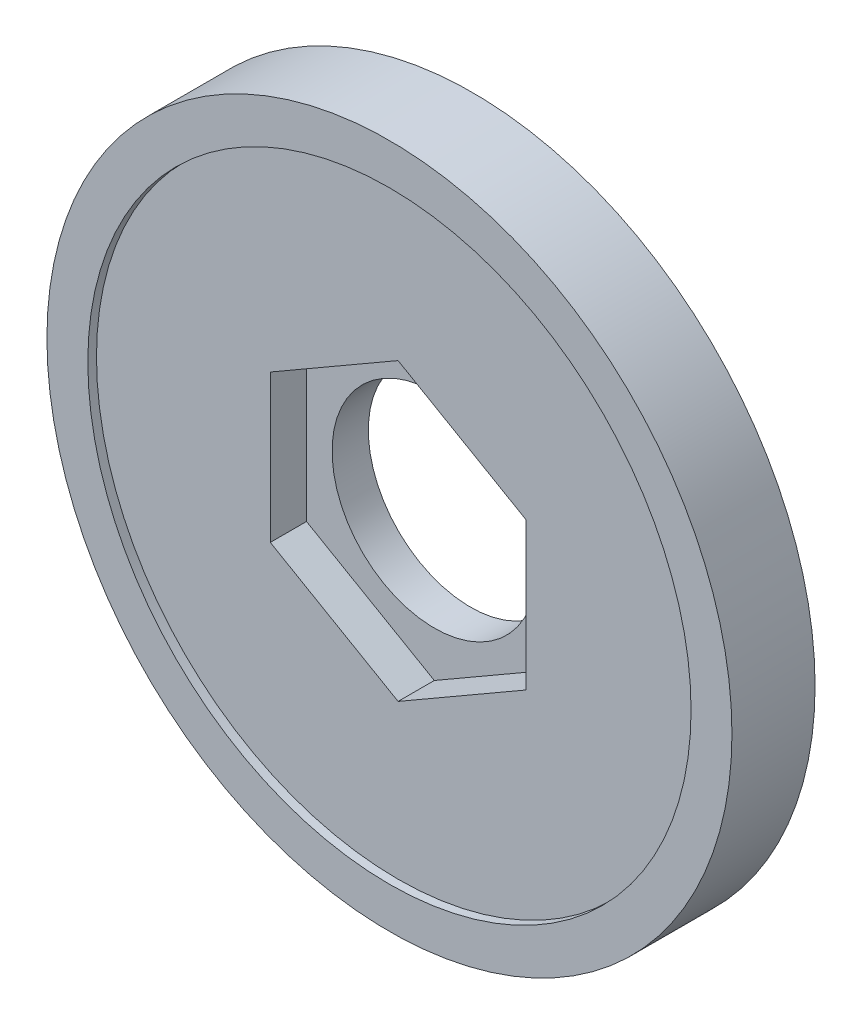
ISO-10303-21;
HEADER;
FILE_DESCRIPTION(('STEP AP214'),'2;1');
FILE_NAME('part.step','',(''),(''),'','','');
FILE_SCHEMA(('AUTOMOTIVE_DESIGN { 1 0 10303 214 1 1 1 1 }'));
ENDSEC;
DATA;
#1=APPLICATION_CONTEXT('core data for automotive mechanical design processes');
#2=APPLICATION_PROTOCOL_DEFINITION('international standard','automotive_design',2000,#1);
#3=PRODUCT_CONTEXT('',#1,'mechanical');
#4=PRODUCT('Part','Part','',(#3));
#5=PRODUCT_RELATED_PRODUCT_CATEGORY('part','',(#4));
#6=PRODUCT_DEFINITION_FORMATION('','',#4);
#7=PRODUCT_DEFINITION_CONTEXT('part definition',#1,'design');
#8=PRODUCT_DEFINITION('design','',#6,#7);
#9=PRODUCT_DEFINITION_SHAPE('','',#8);
#10=(LENGTH_UNIT() NAMED_UNIT(*) SI_UNIT(.MILLI.,.METRE.));
#11=(NAMED_UNIT(*) PLANE_ANGLE_UNIT() SI_UNIT($,.RADIAN.));
#12=(NAMED_UNIT(*) SI_UNIT($,.STERADIAN.) SOLID_ANGLE_UNIT());
#13=UNCERTAINTY_MEASURE_WITH_UNIT(LENGTH_MEASURE(1.E-05),#10,'distance_accuracy_value','');
#14=(GEOMETRIC_REPRESENTATION_CONTEXT(3) GLOBAL_UNCERTAINTY_ASSIGNED_CONTEXT((#13)) GLOBAL_UNIT_ASSIGNED_CONTEXT((#10,
#11,#12)) REPRESENTATION_CONTEXT('',''));
#15=CARTESIAN_POINT('',(0.,0.,0.));
#16=DIRECTION('',(0.,0.,1.));
#17=DIRECTION('',(1.,0.,0.));
#18=AXIS2_PLACEMENT_3D('',#15,#16,#17);
#19=CARTESIAN_POINT('',(0.,0.,0.));
#20=DIRECTION('',(0.,0.,1.));
#21=DIRECTION('',(1.,0.,0.));
#22=AXIS2_PLACEMENT_3D('',#19,#20,#21);
#23=PLANE('',#22);
#24=CARTESIAN_POINT('',(0.,0.,0.));
#25=DIRECTION('',(0.,0.,-1.));
#26=DIRECTION('',(-1.,0.,0.));
#27=AXIS2_PLACEMENT_3D('',#24,#25,#26);
#28=CIRCLE('',#27,13.208);
#29=CARTESIAN_POINT('',(-13.208,0.,0.));
#30=VERTEX_POINT('',#29);
#31=EDGE_CURVE('E13',#30,#30,#28,.T.);
#32=ORIENTED_EDGE('',*,*,#31,.F.);
#33=EDGE_LOOP('',(#32));
#34=FACE_BOUND('',#33,.T.);
#35=CARTESIAN_POINT('',(0.,0.,0.));
#36=DIRECTION('',(0.,0.,1.));
#37=DIRECTION('',(1.,0.,0.));
#38=AXIS2_PLACEMENT_3D('',#35,#36,#37);
#39=CIRCLE('',#38,17.018);
#40=CARTESIAN_POINT('',(17.018,0.,0.));
#41=VERTEX_POINT('',#40);
#42=EDGE_CURVE('E60',#41,#41,#39,.T.);
#43=ORIENTED_EDGE('',*,*,#42,.F.);
#44=EDGE_LOOP('',(#43));
#45=FACE_BOUND('',#44,.T.);
#46=ADVANCED_FACE('F50',(#34,#45),#23,.F.);
#47=CARTESIAN_POINT('',(0.,0.,3.70000000000001));
#48=DIRECTION('',(0.,0.,-1.));
#49=DIRECTION('',(-1.,0.,0.));
#50=AXIS2_PLACEMENT_3D('',#47,#48,#49);
#51=CYLINDRICAL_SURFACE('',#50,17.018);
#52=ORIENTED_EDGE('',*,*,#42,.T.);
#53=EDGE_LOOP('',(#52));
#54=FACE_BOUND('',#53,.T.);
#55=CARTESIAN_POINT('',(0.,0.,4.12999999999999));
#56=DIRECTION('',(0.,0.,1.));
#57=DIRECTION('',(1.,0.,0.));
#58=AXIS2_PLACEMENT_3D('',#55,#56,#57);
#59=CIRCLE('',#58,17.018);
#60=CARTESIAN_POINT('',(17.018,0.,4.12999999999999));
#61=VERTEX_POINT('',#60);
#62=EDGE_CURVE('E257',#61,#61,#59,.T.);
#63=ORIENTED_EDGE('',*,*,#62,.F.);
#64=EDGE_LOOP('',(#63));
#65=FACE_BOUND('',#64,.T.);
#66=ADVANCED_FACE('F196',(#54,#65),#51,.T.);
#67=CARTESIAN_POINT('',(0.,0.,0.099999999999989));
#68=DIRECTION('',(0.,0.,-1.));
#69=DIRECTION('',(-1.,0.,0.));
#70=AXIS2_PLACEMENT_3D('',#67,#68,#69);
#71=CYLINDRICAL_SURFACE('',#70,13.208);
#72=CARTESIAN_POINT('',(0.,0.,0.099999999999989));
#73=DIRECTION('',(0.,0.,-1.));
#74=DIRECTION('',(-1.,0.,0.));
#75=AXIS2_PLACEMENT_3D('',#72,#73,#74);
#76=CIRCLE('',#75,13.208);
#77=CARTESIAN_POINT('',(-13.208,0.,0.099999999999989));
#78=VERTEX_POINT('',#77);
#79=EDGE_CURVE('E54',#78,#78,#76,.T.);
#80=ORIENTED_EDGE('',*,*,#79,.F.);
#81=EDGE_LOOP('',(#80));
#82=FACE_BOUND('',#81,.T.);
#83=ORIENTED_EDGE('',*,*,#31,.T.);
#84=EDGE_LOOP('',(#83));
#85=FACE_BOUND('',#84,.T.);
#86=ADVANCED_FACE('F52',(#82,#85),#71,.F.);
#87=CARTESIAN_POINT('',(0.,0.,0.099999999999989));
#88=DIRECTION('',(0.,0.,-1.));
#89=DIRECTION('',(-1.,0.,0.));
#90=AXIS2_PLACEMENT_3D('',#87,#88,#89);
#91=PLANE('',#90);
#92=CARTESIAN_POINT('',(0.,0.,0.099999999999989));
#93=DIRECTION('',(0.,0.,1.));
#94=DIRECTION('',(1.,0.,0.));
#95=AXIS2_PLACEMENT_3D('',#92,#93,#94);
#96=CIRCLE('',#95,5.08);
#97=CARTESIAN_POINT('',(5.08000000000001,0.,0.099999999999989));
#98=VERTEX_POINT('',#97);
#99=EDGE_CURVE('E149',#98,#98,#96,.T.);
#100=ORIENTED_EDGE('',*,*,#99,.T.);
#101=EDGE_LOOP('',(#100));
#102=FACE_BOUND('',#101,.T.);
#103=ORIENTED_EDGE('',*,*,#79,.T.);
#104=EDGE_LOOP('',(#103));
#105=FACE_BOUND('',#104,.T.);
#106=ADVANCED_FACE('F192',(#102,#105),#91,.T.);
#107=CARTESIAN_POINT('',(0.,0.,3.70000000000001));
#108=DIRECTION('',(0.,0.,1.));
#109=DIRECTION('',(1.,0.,0.));
#110=AXIS2_PLACEMENT_3D('',#107,#108,#109);
#111=PLANE('',#110);
#112=DIRECTION('',(0.,1.,0.));
#113=VECTOR('',#112,1.);
#114=CARTESIAN_POINT('',(6.35000000000001,-3.6661742093541,3.70000000000001));
#115=LINE('',#114,#113);
#116=CARTESIAN_POINT('',(6.35000000000001,-3.6661742093541,3.70000000000001));
#117=VERTEX_POINT('',#116);
#118=CARTESIAN_POINT('',(6.34999999999999,3.66617420935417,3.70000000000001));
#119=VERTEX_POINT('',#118);
#120=EDGE_CURVE('E67',#117,#119,#115,.T.);
#121=ORIENTED_EDGE('',*,*,#120,.F.);
#122=DIRECTION('',(0.86602540378444,0.500000000000001,0.));
#123=VECTOR('',#122,1.);
#124=CARTESIAN_POINT('',(0.,-7.33234841870824,3.70000000000001));
#125=LINE('',#124,#123);
#126=CARTESIAN_POINT('',(0.,-7.33234841870824,3.70000000000001));
#127=VERTEX_POINT('',#126);
#128=EDGE_CURVE('E162',#127,#117,#125,.T.);
#129=ORIENTED_EDGE('',*,*,#128,.F.);
#130=DIRECTION('',(0.86602540378444,-0.500000000000001,0.));
#131=VECTOR('',#130,1.);
#132=CARTESIAN_POINT('',(-6.35000000000002,-3.6661742093541,3.70000000000001));
#133=LINE('',#132,#131);
#134=CARTESIAN_POINT('',(-6.35000000000002,-3.6661742093541,3.70000000000001));
#135=VERTEX_POINT('',#134);
#136=EDGE_CURVE('E159',#135,#127,#133,.T.);
#137=ORIENTED_EDGE('',*,*,#136,.F.);
#138=DIRECTION('',(0.,-1.,0.));
#139=VECTOR('',#138,1.);
#140=CARTESIAN_POINT('',(-6.35000000000002,3.66617420935416,3.70000000000001));
#141=LINE('',#140,#139);
#142=CARTESIAN_POINT('',(-6.35000000000002,3.66617420935416,3.70000000000001));
#143=VERTEX_POINT('',#142);
#144=EDGE_CURVE('E115',#143,#135,#141,.T.);
#145=ORIENTED_EDGE('',*,*,#144,.F.);
#146=DIRECTION('',(-0.86602540378444,-0.5,0.));
#147=VECTOR('',#146,1.);
#148=CARTESIAN_POINT('',(0.,7.33234841870829,3.70000000000001));
#149=LINE('',#148,#147);
#150=CARTESIAN_POINT('',(0.,7.33234841870829,3.70000000000001));
#151=VERTEX_POINT('',#150);
#152=EDGE_CURVE('E153',#151,#143,#149,.T.);
#153=ORIENTED_EDGE('',*,*,#152,.F.);
#154=DIRECTION('',(-0.86602540378444,0.500000000000001,0.));
#155=VECTOR('',#154,1.);
#156=CARTESIAN_POINT('',(6.34999999999999,3.66617420935417,3.70000000000001));
#157=LINE('',#156,#155);
#158=EDGE_CURVE('E148',#119,#151,#157,.T.);
#159=ORIENTED_EDGE('',*,*,#158,.F.);
#160=EDGE_LOOP('',(#121,#129,#137,#145,#153,#159));
#161=FACE_BOUND('',#160,.T.);
#162=CARTESIAN_POINT('',(0.,0.,3.70000000000001));
#163=DIRECTION('',(0.,0.,1.));
#164=DIRECTION('',(1.,0.,0.));
#165=AXIS2_PLACEMENT_3D('',#162,#163,#164);
#166=CIRCLE('',#165,14.986);
#167=CARTESIAN_POINT('',(14.986,0.,3.70000000000001));
#168=VERTEX_POINT('',#167);
#169=EDGE_CURVE('E168',#168,#168,#166,.F.);
#170=ORIENTED_EDGE('',*,*,#169,.F.);
#171=EDGE_LOOP('',(#170));
#172=FACE_BOUND('',#171,.T.);
#173=ADVANCED_FACE('F206',(#161,#172),#111,.T.);
#174=CARTESIAN_POINT('',(6.35000000000001,-3.6661742093541,1.90000000000001));
#175=DIRECTION('',(1.,0.,0.));
#176=DIRECTION('',(0.,1.,0.));
#177=AXIS2_PLACEMENT_3D('',#174,#175,#176);
#178=PLANE('',#177);
#179=ORIENTED_EDGE('',*,*,#120,.T.);
#180=DIRECTION('',(0.,0.,1.));
#181=VECTOR('',#180,1.);
#182=CARTESIAN_POINT('',(6.34999999999999,3.66617420935417,1.90000000000001));
#183=LINE('',#182,#181);
#184=CARTESIAN_POINT('',(6.34999999999999,3.66617420935417,1.90000000000001));
#185=VERTEX_POINT('',#184);
#186=EDGE_CURVE('E97',#185,#119,#183,.T.);
#187=ORIENTED_EDGE('',*,*,#186,.F.);
#188=DIRECTION('',(0.,1.,0.));
#189=VECTOR('',#188,1.);
#190=CARTESIAN_POINT('',(6.35000000000001,-3.6661742093541,1.90000000000001));
#191=LINE('',#190,#189);
#192=CARTESIAN_POINT('',(6.35000000000001,-3.6661742093541,1.90000000000001));
#193=VERTEX_POINT('',#192);
#194=EDGE_CURVE('E165',#193,#185,#191,.T.);
#195=ORIENTED_EDGE('',*,*,#194,.F.);
#196=DIRECTION('',(0.,0.,1.));
#197=VECTOR('',#196,1.);
#198=CARTESIAN_POINT('',(6.35000000000001,-3.6661742093541,1.90000000000001));
#199=LINE('',#198,#197);
#200=EDGE_CURVE('E75',#193,#117,#199,.T.);
#201=ORIENTED_EDGE('',*,*,#200,.T.);
#202=EDGE_LOOP('',(#179,#187,#195,#201));
#203=FACE_BOUND('',#202,.T.);
#204=ADVANCED_FACE('F212',(#203),#178,.F.);
#205=CARTESIAN_POINT('',(0.,-7.33234841870824,1.90000000000001));
#206=DIRECTION('',(0.500000000000001,-0.86602540378444,0.));
#207=DIRECTION('',(0.86602540378444,0.500000000000001,0.));
#208=AXIS2_PLACEMENT_3D('',#205,#206,#207);
#209=PLANE('',#208);
#210=ORIENTED_EDGE('',*,*,#128,.T.);
#211=ORIENTED_EDGE('',*,*,#200,.F.);
#212=DIRECTION('',(0.86602540378444,0.500000000000001,0.));
#213=VECTOR('',#212,1.);
#214=CARTESIAN_POINT('',(0.,-7.33234841870824,1.90000000000001));
#215=LINE('',#214,#213);
#216=CARTESIAN_POINT('',(0.,-7.33234841870824,1.90000000000001));
#217=VERTEX_POINT('',#216);
#218=EDGE_CURVE('E129',#217,#193,#215,.T.);
#219=ORIENTED_EDGE('',*,*,#218,.F.);
#220=DIRECTION('',(0.,0.,1.));
#221=VECTOR('',#220,1.);
#222=CARTESIAN_POINT('',(0.,-7.33234841870824,1.90000000000001));
#223=LINE('',#222,#221);
#224=EDGE_CURVE('E120',#217,#127,#223,.T.);
#225=ORIENTED_EDGE('',*,*,#224,.T.);
#226=EDGE_LOOP('',(#210,#211,#219,#225));
#227=FACE_BOUND('',#226,.T.);
#228=ADVANCED_FACE('F219',(#227),#209,.F.);
#229=CARTESIAN_POINT('',(-6.35000000000002,-3.6661742093541,1.90000000000001));
#230=DIRECTION('',(-0.500000000000001,-0.86602540378444,0.));
#231=DIRECTION('',(0.86602540378444,-0.500000000000001,0.));
#232=AXIS2_PLACEMENT_3D('',#229,#230,#231);
#233=PLANE('',#232);
#234=ORIENTED_EDGE('',*,*,#136,.T.);
#235=ORIENTED_EDGE('',*,*,#224,.F.);
#236=DIRECTION('',(0.86602540378444,-0.500000000000001,0.));
#237=VECTOR('',#236,1.);
#238=CARTESIAN_POINT('',(-6.35000000000002,-3.6661742093541,1.90000000000001));
#239=LINE('',#238,#237);
#240=CARTESIAN_POINT('',(-6.35000000000002,-3.6661742093541,1.90000000000001));
#241=VERTEX_POINT('',#240);
#242=EDGE_CURVE('E124',#241,#217,#239,.T.);
#243=ORIENTED_EDGE('',*,*,#242,.F.);
#244=DIRECTION('',(0.,0.,1.));
#245=VECTOR('',#244,1.);
#246=CARTESIAN_POINT('',(-6.35000000000002,-3.6661742093541,1.90000000000001));
#247=LINE('',#246,#245);
#248=EDGE_CURVE('E108',#241,#135,#247,.T.);
#249=ORIENTED_EDGE('',*,*,#248,.T.);
#250=EDGE_LOOP('',(#234,#235,#243,#249));
#251=FACE_BOUND('',#250,.T.);
#252=ADVANCED_FACE('F125',(#251),#233,.F.);
#253=CARTESIAN_POINT('',(-6.35000000000002,3.66617420935416,1.90000000000001));
#254=DIRECTION('',(-1.,0.,0.));
#255=DIRECTION('',(0.,-1.,0.));
#256=AXIS2_PLACEMENT_3D('',#253,#254,#255);
#257=PLANE('',#256);
#258=ORIENTED_EDGE('',*,*,#144,.T.);
#259=ORIENTED_EDGE('',*,*,#248,.F.);
#260=DIRECTION('',(0.,-1.,0.));
#261=VECTOR('',#260,1.);
#262=CARTESIAN_POINT('',(-6.35000000000002,3.66617420935416,1.90000000000001));
#263=LINE('',#262,#261);
#264=CARTESIAN_POINT('',(-6.35000000000002,3.66617420935416,1.90000000000001));
#265=VERTEX_POINT('',#264);
#266=EDGE_CURVE('E112',#265,#241,#263,.T.);
#267=ORIENTED_EDGE('',*,*,#266,.F.);
#268=DIRECTION('',(0.,0.,1.));
#269=VECTOR('',#268,1.);
#270=CARTESIAN_POINT('',(-6.35000000000002,3.66617420935416,1.90000000000001));
#271=LINE('',#270,#269);
#272=EDGE_CURVE('E121',#265,#143,#271,.T.);
#273=ORIENTED_EDGE('',*,*,#272,.T.);
#274=EDGE_LOOP('',(#258,#259,#267,#273));
#275=FACE_BOUND('',#274,.T.);
#276=ADVANCED_FACE('F110',(#275),#257,.F.);
#277=CARTESIAN_POINT('',(0.,7.33234841870829,1.90000000000001));
#278=DIRECTION('',(-0.500000000000001,0.866025403784441,0.));
#279=DIRECTION('',(-0.866025403784441,-0.500000000000001,0.));
#280=AXIS2_PLACEMENT_3D('',#277,#278,#279);
#281=PLANE('',#280);
#282=ORIENTED_EDGE('',*,*,#152,.T.);
#283=ORIENTED_EDGE('',*,*,#272,.F.);
#284=DIRECTION('',(-0.86602540378444,-0.5,0.));
#285=VECTOR('',#284,1.);
#286=CARTESIAN_POINT('',(0.,7.33234841870829,1.90000000000001));
#287=LINE('',#286,#285);
#288=CARTESIAN_POINT('',(0.,7.33234841870829,1.90000000000001));
#289=VERTEX_POINT('',#288);
#290=EDGE_CURVE('E135',#289,#265,#287,.T.);
#291=ORIENTED_EDGE('',*,*,#290,.F.);
#292=DIRECTION('',(0.,0.,1.));
#293=VECTOR('',#292,1.);
#294=CARTESIAN_POINT('',(0.,7.33234841870829,1.90000000000001));
#295=LINE('',#294,#293);
#296=EDGE_CURVE('E173',#289,#151,#295,.T.);
#297=ORIENTED_EDGE('',*,*,#296,.T.);
#298=EDGE_LOOP('',(#282,#283,#291,#297));
#299=FACE_BOUND('',#298,.T.);
#300=ADVANCED_FACE('F223',(#299),#281,.F.);
#301=CARTESIAN_POINT('',(6.34999999999999,3.66617420935417,1.90000000000001));
#302=DIRECTION('',(0.500000000000001,0.86602540378444,0.));
#303=DIRECTION('',(-0.86602540378444,0.500000000000001,0.));
#304=AXIS2_PLACEMENT_3D('',#301,#302,#303);
#305=PLANE('',#304);
#306=ORIENTED_EDGE('',*,*,#158,.T.);
#307=ORIENTED_EDGE('',*,*,#296,.F.);
#308=DIRECTION('',(-0.86602540378444,0.500000000000001,0.));
#309=VECTOR('',#308,1.);
#310=CARTESIAN_POINT('',(6.34999999999999,3.66617420935417,1.90000000000001));
#311=LINE('',#310,#309);
#312=EDGE_CURVE('E140',#185,#289,#311,.T.);
#313=ORIENTED_EDGE('',*,*,#312,.F.);
#314=ORIENTED_EDGE('',*,*,#186,.T.);
#315=EDGE_LOOP('',(#306,#307,#313,#314));
#316=FACE_BOUND('',#315,.T.);
#317=ADVANCED_FACE('F220',(#316),#305,.F.);
#318=CARTESIAN_POINT('',(0.,0.,1.90000000000001));
#319=DIRECTION('',(0.,0.,1.));
#320=DIRECTION('',(1.,0.,0.));
#321=AXIS2_PLACEMENT_3D('',#318,#319,#320);
#322=PLANE('',#321);
#323=CARTESIAN_POINT('',(0.,0.,1.90000000000001));
#324=DIRECTION('',(0.,0.,1.));
#325=DIRECTION('',(1.,0.,0.));
#326=AXIS2_PLACEMENT_3D('',#323,#324,#325);
#327=CIRCLE('',#326,5.08);
#328=CARTESIAN_POINT('',(5.08000000000001,0.,1.90000000000001));
#329=VERTEX_POINT('',#328);
#330=EDGE_CURVE('E262',#329,#329,#327,.T.);
#331=ORIENTED_EDGE('',*,*,#330,.F.);
#332=EDGE_LOOP('',(#331));
#333=FACE_BOUND('',#332,.T.);
#334=ORIENTED_EDGE('',*,*,#194,.T.);
#335=ORIENTED_EDGE('',*,*,#312,.T.);
#336=ORIENTED_EDGE('',*,*,#290,.T.);
#337=ORIENTED_EDGE('',*,*,#266,.T.);
#338=ORIENTED_EDGE('',*,*,#242,.T.);
#339=ORIENTED_EDGE('',*,*,#218,.T.);
#340=EDGE_LOOP('',(#334,#335,#336,#337,#338,#339));
#341=FACE_BOUND('',#340,.T.);
#342=ADVANCED_FACE('F132',(#333,#341),#322,.T.);
#343=CARTESIAN_POINT('',(0.,0.,0.099999999999989));
#344=DIRECTION('',(0.,0.,1.));
#345=DIRECTION('',(1.,0.,0.));
#346=AXIS2_PLACEMENT_3D('',#343,#344,#345);
#347=CYLINDRICAL_SURFACE('',#346,5.08);
#348=ORIENTED_EDGE('',*,*,#99,.F.);
#349=EDGE_LOOP('',(#348));
#350=FACE_BOUND('',#349,.T.);
#351=ORIENTED_EDGE('',*,*,#330,.T.);
#352=EDGE_LOOP('',(#351));
#353=FACE_BOUND('',#352,.T.);
#354=ADVANCED_FACE('F236',(#350,#353),#347,.F.);
#355=CARTESIAN_POINT('',(0.,0.,4.12999999999999));
#356=DIRECTION('',(0.,0.,1.));
#357=DIRECTION('',(1.,0.,0.));
#358=AXIS2_PLACEMENT_3D('',#355,#356,#357);
#359=PLANE('',#358);
#360=ORIENTED_EDGE('',*,*,#62,.T.);
#361=EDGE_LOOP('',(#360));
#362=FACE_BOUND('',#361,.T.);
#363=CARTESIAN_POINT('',(0.,0.,4.12999999999999));
#364=DIRECTION('',(0.,0.,1.));
#365=DIRECTION('',(1.,0.,0.));
#366=AXIS2_PLACEMENT_3D('',#363,#364,#365);
#367=CIRCLE('',#366,14.986);
#368=CARTESIAN_POINT('',(14.986,0.,4.12999999999999));
#369=VERTEX_POINT('',#368);
#370=EDGE_CURVE('E253',#369,#369,#367,.T.);
#371=ORIENTED_EDGE('',*,*,#370,.F.);
#372=EDGE_LOOP('',(#371));
#373=FACE_BOUND('',#372,.T.);
#374=ADVANCED_FACE('F240',(#362,#373),#359,.T.);
#375=CARTESIAN_POINT('',(0.,0.,4.12999999999999));
#376=DIRECTION('',(0.,0.,-1.));
#377=DIRECTION('',(-1.,0.,0.));
#378=AXIS2_PLACEMENT_3D('',#375,#376,#377);
#379=CYLINDRICAL_SURFACE('',#378,14.986);
#380=ORIENTED_EDGE('',*,*,#370,.T.);
#381=EDGE_LOOP('',(#380));
#382=FACE_BOUND('',#381,.T.);
#383=ORIENTED_EDGE('',*,*,#169,.T.);
#384=EDGE_LOOP('',(#383));
#385=FACE_BOUND('',#384,.T.);
#386=ADVANCED_FACE('F244',(#382,#385),#379,.F.);
#387=CLOSED_SHELL('',(#46,#66,#86,#106,#173,#204,#228,#252,#276,#300,#317,#342,#354,#374,#386));
#388=MANIFOLD_SOLID_BREP('B2',#387);
#389=ADVANCED_BREP_SHAPE_REPRESENTATION('',(#18,#388),#14);
#390=SHAPE_DEFINITION_REPRESENTATION(#9,#389);
ENDSEC;
END-ISO-10303-21;
